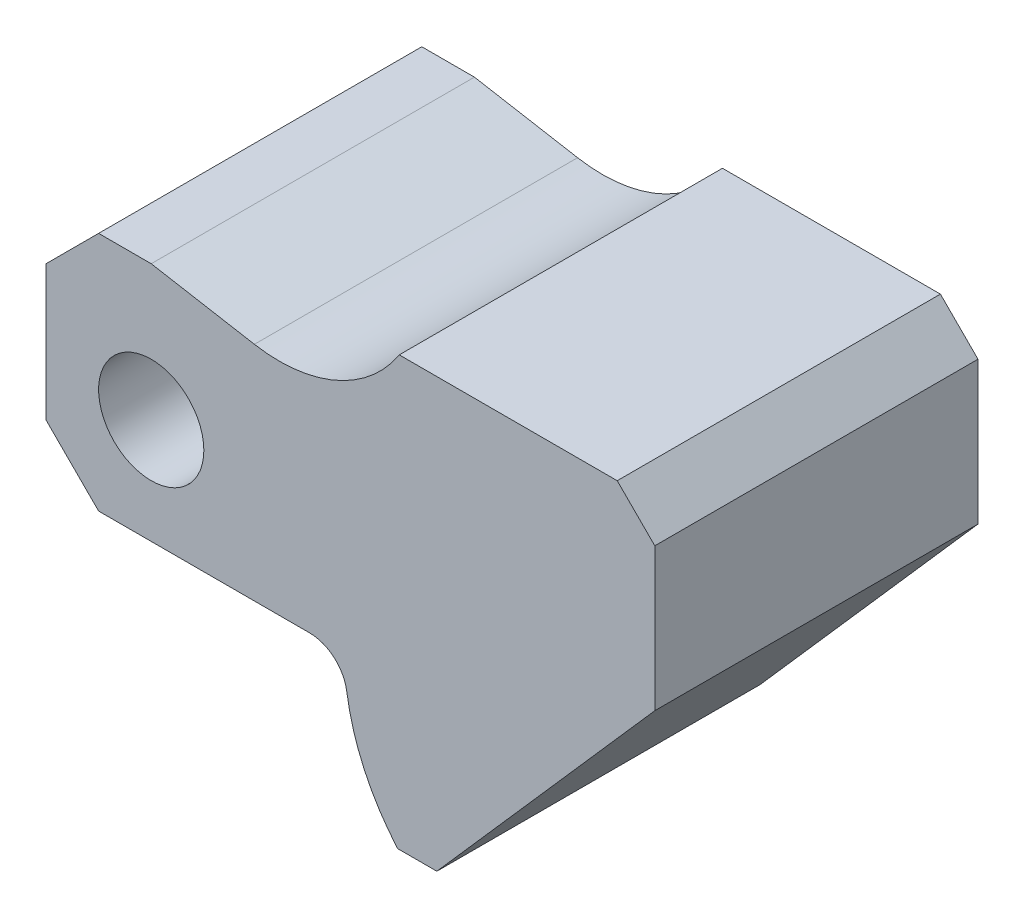
ISO-10303-21;
HEADER;
FILE_DESCRIPTION(('STEP AP214'),'2;1');
FILE_NAME('part.step','',(''),(''),'','','');
FILE_SCHEMA(('AUTOMOTIVE_DESIGN { 1 0 10303 214 1 1 1 1 }'));
ENDSEC;
DATA;
#1=APPLICATION_CONTEXT('core data for automotive mechanical design processes');
#2=APPLICATION_PROTOCOL_DEFINITION('international standard','automotive_design',2000,#1);
#3=PRODUCT_CONTEXT('',#1,'mechanical');
#4=PRODUCT('Part','Part','',(#3));
#5=PRODUCT_RELATED_PRODUCT_CATEGORY('part','',(#4));
#6=PRODUCT_DEFINITION_FORMATION('','',#4);
#7=PRODUCT_DEFINITION_CONTEXT('part definition',#1,'design');
#8=PRODUCT_DEFINITION('design','',#6,#7);
#9=PRODUCT_DEFINITION_SHAPE('','',#8);
#10=(LENGTH_UNIT() NAMED_UNIT(*) SI_UNIT(.MILLI.,.METRE.));
#11=(NAMED_UNIT(*) PLANE_ANGLE_UNIT() SI_UNIT($,.RADIAN.));
#12=(NAMED_UNIT(*) SI_UNIT($,.STERADIAN.) SOLID_ANGLE_UNIT());
#13=UNCERTAINTY_MEASURE_WITH_UNIT(LENGTH_MEASURE(1.E-05),#10,'distance_accuracy_value','');
#14=(GEOMETRIC_REPRESENTATION_CONTEXT(3) GLOBAL_UNCERTAINTY_ASSIGNED_CONTEXT((#13)) GLOBAL_UNIT_ASSIGNED_CONTEXT((#10,
#11,#12)) REPRESENTATION_CONTEXT('',''));
#15=CARTESIAN_POINT('',(0.,0.,0.));
#16=DIRECTION('',(0.,0.,1.));
#17=DIRECTION('',(1.,0.,0.));
#18=AXIS2_PLACEMENT_3D('',#15,#16,#17);
#19=CARTESIAN_POINT('',(432.512223927165,870.981308331483,1092.2));
#20=DIRECTION('',(0.,0.,1.));
#21=DIRECTION('',(1.,0.,0.));
#22=AXIS2_PLACEMENT_3D('',#19,#20,#21);
#23=PLANE('',#22);
#24=DIRECTION('',(-0.707106781186547,-0.707106781186548,0.));
#25=VECTOR('',#24,1.);
#26=CARTESIAN_POINT('',(-355.6,279.4,1092.2));
#27=LINE('',#26,#25);
#28=CARTESIAN_POINT('',(-177.8,457.2,1092.2));
#29=VERTEX_POINT('',#28);
#30=CARTESIAN_POINT('',(-355.6,279.4,1092.2));
#31=VERTEX_POINT('',#30);
#32=EDGE_CURVE('E199',#29,#31,#27,.T.);
#33=ORIENTED_EDGE('',*,*,#32,.T.);
#34=DIRECTION('',(0.,-1.,0.));
#35=VECTOR('',#34,1.);
#36=CARTESIAN_POINT('',(-355.6,279.4,1092.2));
#37=LINE('',#36,#35);
#38=CARTESIAN_POINT('',(-355.6,-177.8,1092.2));
#39=VERTEX_POINT('',#38);
#40=EDGE_CURVE('E116',#31,#39,#37,.T.);
#41=ORIENTED_EDGE('',*,*,#40,.T.);
#42=DIRECTION('',(0.707106781186548,-0.707106781186547,0.));
#43=VECTOR('',#42,1.);
#44=CARTESIAN_POINT('',(-355.6,-177.8,1092.2));
#45=LINE('',#44,#43);
#46=CARTESIAN_POINT('',(-177.8,-355.6,1092.2));
#47=VERTEX_POINT('',#46);
#48=EDGE_CURVE('E232',#39,#47,#45,.T.);
#49=ORIENTED_EDGE('',*,*,#48,.T.);
#50=DIRECTION('',(1.,0.,0.));
#51=VECTOR('',#50,1.);
#52=CARTESIAN_POINT('',(0.,-355.6,1092.2));
#53=LINE('',#52,#51);
#54=CARTESIAN_POINT('',(535.092306886378,-355.6,1092.2));
#55=VERTEX_POINT('',#54);
#56=EDGE_CURVE('E250',#47,#55,#53,.T.);
#57=ORIENTED_EDGE('',*,*,#56,.T.);
#58=CARTESIAN_POINT('',(535.092306886378,-482.6,1092.2));
#59=DIRECTION('',(0.,0.,-1.));
#60=DIRECTION('',(1.,0.,0.));
#61=AXIS2_PLACEMENT_3D('',#58,#59,#60);
#62=CIRCLE('',#61,127.);
#63=CARTESIAN_POINT('',(660.711530918239,-463.923529411765,1092.2));
#64=VERTEX_POINT('',#63);
#65=EDGE_CURVE('E247',#55,#64,#62,.T.);
#66=ORIENTED_EDGE('',*,*,#65,.T.);
#67=CARTESIAN_POINT('',(1389.30303030303,-355.6,1092.2));
#68=DIRECTION('',(0.,0.,1.));
#69=DIRECTION('',(-1.,0.,0.));
#70=AXIS2_PLACEMENT_3D('',#67,#68,#69);
#71=CIRCLE('',#70,736.6);
#72=CARTESIAN_POINT('',(832.816911877782,-838.2,1092.2));
#73=VERTEX_POINT('',#72);
#74=EDGE_CURVE('E249',#64,#73,#71,.T.);
#75=ORIENTED_EDGE('',*,*,#74,.T.);
#76=DIRECTION('',(1.,0.,0.));
#77=VECTOR('',#76,1.);
#78=CARTESIAN_POINT('',(832.816911877781,-838.2,1092.2));
#79=LINE('',#78,#77);
#80=CARTESIAN_POINT('',(965.2,-838.2,1092.2));
#81=VERTEX_POINT('',#80);
#82=EDGE_CURVE('E252',#73,#81,#79,.T.);
#83=ORIENTED_EDGE('',*,*,#82,.T.);
#84=DIRECTION('',(0.660114607728679,0.751164898449876,0.));
#85=VECTOR('',#84,1.);
#86=CARTESIAN_POINT('',(965.2,-838.2,1092.2));
#87=LINE('',#86,#85);
#88=CARTESIAN_POINT('',(1701.8,2.4980018054066E-13,1092.2));
#89=VERTEX_POINT('',#88);
#90=EDGE_CURVE('E258',#81,#89,#87,.T.);
#91=ORIENTED_EDGE('',*,*,#90,.T.);
#92=DIRECTION('',(0.,1.,0.));
#93=VECTOR('',#92,1.);
#94=CARTESIAN_POINT('',(1701.8,2.4980018054066E-13,1092.2));
#95=LINE('',#94,#93);
#96=CARTESIAN_POINT('',(1701.8,482.6,1092.2));
#97=VERTEX_POINT('',#96);
#98=EDGE_CURVE('E260',#89,#97,#95,.T.);
#99=ORIENTED_EDGE('',*,*,#98,.T.);
#100=DIRECTION('',(-0.707106781186549,0.707106781186546,0.));
#101=VECTOR('',#100,1.);
#102=CARTESIAN_POINT('',(1701.8,482.6,1092.2));
#103=LINE('',#102,#101);
#104=CARTESIAN_POINT('',(1574.8,609.6,1092.2));
#105=VERTEX_POINT('',#104);
#106=EDGE_CURVE('E262',#97,#105,#103,.T.);
#107=ORIENTED_EDGE('',*,*,#106,.T.);
#108=DIRECTION('',(-1.,0.,0.));
#109=VECTOR('',#108,1.);
#110=CARTESIAN_POINT('',(1574.8,609.6,1092.2));
#111=LINE('',#110,#109);
#112=CARTESIAN_POINT('',(838.199999999999,609.6,1092.2));
#113=VERTEX_POINT('',#112);
#114=EDGE_CURVE('E153',#105,#113,#111,.T.);
#115=ORIENTED_EDGE('',*,*,#114,.T.);
#116=CARTESIAN_POINT('',(432.512223927165,870.981308331483,1092.2));
#117=DIRECTION('',(0.,0.,-1.));
#118=DIRECTION('',(1.,0.,0.));
#119=AXIS2_PLACEMENT_3D('',#116,#117,#118);
#120=CIRCLE('',#119,482.6);
#121=CARTESIAN_POINT('',(348.709613385108,395.71308672779,1092.2));
#122=VERTEX_POINT('',#121);
#123=EDGE_CURVE('E147',#113,#122,#120,.T.);
#124=ORIENTED_EDGE('',*,*,#123,.T.);
#125=DIRECTION('',(-0.984807753012209,0.173648177666924,0.));
#126=VECTOR('',#125,1.);
#127=CARTESIAN_POINT('',(0.,457.2,1092.2));
#128=LINE('',#127,#126);
#129=CARTESIAN_POINT('',(0.,457.2,1092.2));
#130=VERTEX_POINT('',#129);
#131=EDGE_CURVE('E151',#122,#130,#128,.T.);
#132=ORIENTED_EDGE('',*,*,#131,.T.);
#133=DIRECTION('',(-1.,0.,0.));
#134=VECTOR('',#133,1.);
#135=CARTESIAN_POINT('',(0.,457.2,1092.2));
#136=LINE('',#135,#134);
#137=EDGE_CURVE('E55',#130,#29,#136,.T.);
#138=ORIENTED_EDGE('',*,*,#137,.T.);
#139=EDGE_LOOP('',(#33,#41,#49,#57,#66,#75,#83,#91,#99,#107,#115,#124,#132,#138));
#140=FACE_BOUND('',#139,.T.);
#141=CARTESIAN_POINT('',(0.,0.,1092.2));
#142=DIRECTION('',(0.,0.,1.));
#143=DIRECTION('',(1.,0.,0.));
#144=AXIS2_PLACEMENT_3D('',#141,#142,#143);
#145=CIRCLE('',#144,177.8);
#146=CARTESIAN_POINT('',(177.8,0.,1092.2));
#147=VERTEX_POINT('',#146);
#148=EDGE_CURVE('E175',#147,#147,#145,.T.);
#149=ORIENTED_EDGE('',*,*,#148,.F.);
#150=EDGE_LOOP('',(#149));
#151=FACE_BOUND('',#150,.T.);
#152=ADVANCED_FACE('F38',(#140,#151),#23,.T.);
#153=CARTESIAN_POINT('',(432.512223927165,870.981308331483,0.));
#154=DIRECTION('',(0.,0.,1.));
#155=DIRECTION('',(1.,0.,0.));
#156=AXIS2_PLACEMENT_3D('',#153,#154,#155);
#157=PLANE('',#156);
#158=DIRECTION('',(-0.707106781186547,-0.707106781186548,0.));
#159=VECTOR('',#158,1.);
#160=CARTESIAN_POINT('',(-355.6,279.4,0.));
#161=LINE('',#160,#159);
#162=CARTESIAN_POINT('',(-177.8,457.2,0.));
#163=VERTEX_POINT('',#162);
#164=CARTESIAN_POINT('',(-355.6,279.4,0.));
#165=VERTEX_POINT('',#164);
#166=EDGE_CURVE('E171',#163,#165,#161,.T.);
#167=ORIENTED_EDGE('',*,*,#166,.F.);
#168=DIRECTION('',(-1.,0.,0.));
#169=VECTOR('',#168,1.);
#170=CARTESIAN_POINT('',(0.,457.2,0.));
#171=LINE('',#170,#169);
#172=CARTESIAN_POINT('',(0.,457.2,0.));
#173=VERTEX_POINT('',#172);
#174=EDGE_CURVE('E108',#173,#163,#171,.T.);
#175=ORIENTED_EDGE('',*,*,#174,.F.);
#176=DIRECTION('',(-0.984807753012209,0.173648177666924,0.));
#177=VECTOR('',#176,1.);
#178=CARTESIAN_POINT('',(0.,457.2,0.));
#179=LINE('',#178,#177);
#180=CARTESIAN_POINT('',(348.709613385108,395.71308672779,0.));
#181=VERTEX_POINT('',#180);
#182=EDGE_CURVE('E102',#181,#173,#179,.T.);
#183=ORIENTED_EDGE('',*,*,#182,.F.);
#184=CARTESIAN_POINT('',(432.512223927165,870.981308331483,0.));
#185=DIRECTION('',(0.,0.,-1.));
#186=DIRECTION('',(1.,0.,0.));
#187=AXIS2_PLACEMENT_3D('',#184,#185,#186);
#188=CIRCLE('',#187,482.6);
#189=CARTESIAN_POINT('',(838.199999999999,609.6,0.));
#190=VERTEX_POINT('',#189);
#191=EDGE_CURVE('E161',#190,#181,#188,.T.);
#192=ORIENTED_EDGE('',*,*,#191,.F.);
#193=DIRECTION('',(-1.,0.,0.));
#194=VECTOR('',#193,1.);
#195=CARTESIAN_POINT('',(1574.8,609.6,0.));
#196=LINE('',#195,#194);
#197=CARTESIAN_POINT('',(1574.8,609.6,0.));
#198=VERTEX_POINT('',#197);
#199=EDGE_CURVE('E194',#198,#190,#196,.T.);
#200=ORIENTED_EDGE('',*,*,#199,.F.);
#201=DIRECTION('',(-0.707106781186549,0.707106781186546,0.));
#202=VECTOR('',#201,1.);
#203=CARTESIAN_POINT('',(1701.8,482.6,0.));
#204=LINE('',#203,#202);
#205=CARTESIAN_POINT('',(1701.8,482.6,0.));
#206=VERTEX_POINT('',#205);
#207=EDGE_CURVE('E192',#206,#198,#204,.T.);
#208=ORIENTED_EDGE('',*,*,#207,.F.);
#209=DIRECTION('',(0.,1.,0.));
#210=VECTOR('',#209,1.);
#211=CARTESIAN_POINT('',(1701.8,2.4980018054066E-13,0.));
#212=LINE('',#211,#210);
#213=CARTESIAN_POINT('',(1701.8,2.4980018054066E-13,0.));
#214=VERTEX_POINT('',#213);
#215=EDGE_CURVE('E190',#214,#206,#212,.T.);
#216=ORIENTED_EDGE('',*,*,#215,.F.);
#217=DIRECTION('',(0.660114607728679,0.751164898449876,0.));
#218=VECTOR('',#217,1.);
#219=CARTESIAN_POINT('',(965.2,-838.2,0.));
#220=LINE('',#219,#218);
#221=CARTESIAN_POINT('',(965.2,-838.2,0.));
#222=VERTEX_POINT('',#221);
#223=EDGE_CURVE('E188',#222,#214,#220,.T.);
#224=ORIENTED_EDGE('',*,*,#223,.F.);
#225=DIRECTION('',(1.,0.,0.));
#226=VECTOR('',#225,1.);
#227=CARTESIAN_POINT('',(832.816911877781,-838.2,0.));
#228=LINE('',#227,#226);
#229=CARTESIAN_POINT('',(832.816911877782,-838.2,0.));
#230=VERTEX_POINT('',#229);
#231=EDGE_CURVE('E186',#230,#222,#228,.T.);
#232=ORIENTED_EDGE('',*,*,#231,.F.);
#233=CARTESIAN_POINT('',(1389.30303030303,-355.6,0.));
#234=DIRECTION('',(0.,0.,1.));
#235=DIRECTION('',(-1.,0.,0.));
#236=AXIS2_PLACEMENT_3D('',#233,#234,#235);
#237=CIRCLE('',#236,736.6);
#238=CARTESIAN_POINT('',(660.711530918239,-463.923529411765,0.));
#239=VERTEX_POINT('',#238);
#240=EDGE_CURVE('E184',#239,#230,#237,.T.);
#241=ORIENTED_EDGE('',*,*,#240,.F.);
#242=CARTESIAN_POINT('',(535.092306886378,-482.6,0.));
#243=DIRECTION('',(0.,0.,-1.));
#244=DIRECTION('',(1.,0.,0.));
#245=AXIS2_PLACEMENT_3D('',#242,#243,#244);
#246=CIRCLE('',#245,127.);
#247=CARTESIAN_POINT('',(535.092306886378,-355.6,0.));
#248=VERTEX_POINT('',#247);
#249=EDGE_CURVE('E182',#248,#239,#246,.T.);
#250=ORIENTED_EDGE('',*,*,#249,.F.);
#251=DIRECTION('',(1.,0.,0.));
#252=VECTOR('',#251,1.);
#253=CARTESIAN_POINT('',(0.,-355.6,0.));
#254=LINE('',#253,#252);
#255=CARTESIAN_POINT('',(-177.8,-355.6,0.));
#256=VERTEX_POINT('',#255);
#257=EDGE_CURVE('E180',#256,#248,#254,.T.);
#258=ORIENTED_EDGE('',*,*,#257,.F.);
#259=DIRECTION('',(0.707106781186548,-0.707106781186547,0.));
#260=VECTOR('',#259,1.);
#261=CARTESIAN_POINT('',(-355.6,-177.8,0.));
#262=LINE('',#261,#260);
#263=CARTESIAN_POINT('',(-355.6,-177.8,0.));
#264=VERTEX_POINT('',#263);
#265=EDGE_CURVE('E177',#264,#256,#262,.T.);
#266=ORIENTED_EDGE('',*,*,#265,.F.);
#267=DIRECTION('',(0.,-1.,0.));
#268=VECTOR('',#267,1.);
#269=CARTESIAN_POINT('',(-355.6,279.4,0.));
#270=LINE('',#269,#268);
#271=EDGE_CURVE('E174',#165,#264,#270,.T.);
#272=ORIENTED_EDGE('',*,*,#271,.F.);
#273=EDGE_LOOP('',(#167,#175,#183,#192,#200,#208,#216,#224,#232,#241,#250,#258,#266,#272));
#274=FACE_BOUND('',#273,.T.);
#275=CARTESIAN_POINT('',(0.,0.,0.));
#276=DIRECTION('',(0.,0.,1.));
#277=DIRECTION('',(1.,0.,0.));
#278=AXIS2_PLACEMENT_3D('',#275,#276,#277);
#279=CIRCLE('',#278,177.8);
#280=CARTESIAN_POINT('',(177.8,0.,0.));
#281=VERTEX_POINT('',#280);
#282=EDGE_CURVE('E506',#281,#281,#279,.T.);
#283=ORIENTED_EDGE('',*,*,#282,.T.);
#284=EDGE_LOOP('',(#283));
#285=FACE_BOUND('',#284,.T.);
#286=ADVANCED_FACE('F235',(#274,#285),#157,.F.);
#287=CARTESIAN_POINT('',(-355.6,279.4,1092.2));
#288=DIRECTION('',(0.707106781186548,-0.707106781186547,0.));
#289=DIRECTION('',(0.707106781186547,0.707106781186548,0.));
#290=AXIS2_PLACEMENT_3D('',#287,#288,#289);
#291=PLANE('',#290);
#292=ORIENTED_EDGE('',*,*,#166,.T.);
#293=DIRECTION('',(0.,0.,-1.));
#294=VECTOR('',#293,1.);
#295=CARTESIAN_POINT('',(-355.6,279.4,1092.2));
#296=LINE('',#295,#294);
#297=EDGE_CURVE('E11',#31,#165,#296,.T.);
#298=ORIENTED_EDGE('',*,*,#297,.F.);
#299=ORIENTED_EDGE('',*,*,#32,.F.);
#300=DIRECTION('',(0.,0.,-1.));
#301=VECTOR('',#300,1.);
#302=CARTESIAN_POINT('',(-177.8,457.2,1092.2));
#303=LINE('',#302,#301);
#304=EDGE_CURVE('E167',#29,#163,#303,.T.);
#305=ORIENTED_EDGE('',*,*,#304,.T.);
#306=EDGE_LOOP('',(#292,#298,#299,#305));
#307=FACE_BOUND('',#306,.T.);
#308=ADVANCED_FACE('F40',(#307),#291,.F.);
#309=CARTESIAN_POINT('',(-355.6,279.4,1092.2));
#310=DIRECTION('',(1.,0.,0.));
#311=DIRECTION('',(0.,1.,0.));
#312=AXIS2_PLACEMENT_3D('',#309,#310,#311);
#313=PLANE('',#312);
#314=ORIENTED_EDGE('',*,*,#271,.T.);
#315=DIRECTION('',(0.,0.,-1.));
#316=VECTOR('',#315,1.);
#317=CARTESIAN_POINT('',(-355.6,-177.8,1092.2));
#318=LINE('',#317,#316);
#319=EDGE_CURVE('E47',#39,#264,#318,.T.);
#320=ORIENTED_EDGE('',*,*,#319,.F.);
#321=ORIENTED_EDGE('',*,*,#40,.F.);
#322=ORIENTED_EDGE('',*,*,#297,.T.);
#323=EDGE_LOOP('',(#314,#320,#321,#322));
#324=FACE_BOUND('',#323,.T.);
#325=ADVANCED_FACE('F296',(#324),#313,.F.);
#326=CARTESIAN_POINT('',(-355.6,-177.8,1092.2));
#327=DIRECTION('',(0.707106781186547,0.707106781186548,0.));
#328=DIRECTION('',(-0.707106781186548,0.707106781186547,0.));
#329=AXIS2_PLACEMENT_3D('',#326,#327,#328);
#330=PLANE('',#329);
#331=ORIENTED_EDGE('',*,*,#265,.T.);
#332=DIRECTION('',(0.,0.,-1.));
#333=VECTOR('',#332,1.);
#334=CARTESIAN_POINT('',(-177.8,-355.6,1092.2));
#335=LINE('',#334,#333);
#336=EDGE_CURVE('E224',#47,#256,#335,.T.);
#337=ORIENTED_EDGE('',*,*,#336,.F.);
#338=ORIENTED_EDGE('',*,*,#48,.F.);
#339=ORIENTED_EDGE('',*,*,#319,.T.);
#340=EDGE_LOOP('',(#331,#337,#338,#339));
#341=FACE_BOUND('',#340,.T.);
#342=ADVANCED_FACE('F230',(#341),#330,.F.);
#343=CARTESIAN_POINT('',(0.,-355.6,1092.2));
#344=DIRECTION('',(0.,1.,0.));
#345=DIRECTION('',(-1.,0.,0.));
#346=AXIS2_PLACEMENT_3D('',#343,#344,#345);
#347=PLANE('',#346);
#348=ORIENTED_EDGE('',*,*,#257,.T.);
#349=DIRECTION('',(0.,0.,-1.));
#350=VECTOR('',#349,1.);
#351=CARTESIAN_POINT('',(535.092306886378,-355.6,1092.2));
#352=LINE('',#351,#350);
#353=EDGE_CURVE('E221',#55,#248,#352,.T.);
#354=ORIENTED_EDGE('',*,*,#353,.F.);
#355=ORIENTED_EDGE('',*,*,#56,.F.);
#356=ORIENTED_EDGE('',*,*,#336,.T.);
#357=EDGE_LOOP('',(#348,#354,#355,#356));
#358=FACE_BOUND('',#357,.T.);
#359=ADVANCED_FACE('F241',(#358),#347,.F.);
#360=CARTESIAN_POINT('',(535.092306886378,-482.6,1092.2));
#361=DIRECTION('',(0.,0.,-1.));
#362=DIRECTION('',(-1.,0.,0.));
#363=AXIS2_PLACEMENT_3D('',#360,#361,#362);
#364=CYLINDRICAL_SURFACE('',#363,127.);
#365=ORIENTED_EDGE('',*,*,#249,.T.);
#366=DIRECTION('',(0.,0.,-1.));
#367=VECTOR('',#366,1.);
#368=CARTESIAN_POINT('',(660.711530918239,-463.923529411765,1092.2));
#369=LINE('',#368,#367);
#370=EDGE_CURVE('E218',#64,#239,#369,.T.);
#371=ORIENTED_EDGE('',*,*,#370,.F.);
#372=ORIENTED_EDGE('',*,*,#65,.F.);
#373=ORIENTED_EDGE('',*,*,#353,.T.);
#374=EDGE_LOOP('',(#365,#371,#372,#373));
#375=FACE_BOUND('',#374,.T.);
#376=ADVANCED_FACE('F245',(#375),#364,.F.);
#377=CARTESIAN_POINT('',(1389.30303030303,-355.6,1092.2));
#378=DIRECTION('',(0.,0.,-1.));
#379=DIRECTION('',(-1.,0.,0.));
#380=AXIS2_PLACEMENT_3D('',#377,#378,#379);
#381=CYLINDRICAL_SURFACE('',#380,736.6);
#382=ORIENTED_EDGE('',*,*,#240,.T.);
#383=DIRECTION('',(0.,0.,-1.));
#384=VECTOR('',#383,1.);
#385=CARTESIAN_POINT('',(832.816911877782,-838.2,1092.2));
#386=LINE('',#385,#384);
#387=EDGE_CURVE('E215',#73,#230,#386,.T.);
#388=ORIENTED_EDGE('',*,*,#387,.F.);
#389=ORIENTED_EDGE('',*,*,#74,.F.);
#390=ORIENTED_EDGE('',*,*,#370,.T.);
#391=EDGE_LOOP('',(#382,#388,#389,#390));
#392=FACE_BOUND('',#391,.T.);
#393=ADVANCED_FACE('F309',(#392),#381,.T.);
#394=CARTESIAN_POINT('',(832.816911877781,-838.2,1092.2));
#395=DIRECTION('',(0.,1.,0.));
#396=DIRECTION('',(-1.,0.,0.));
#397=AXIS2_PLACEMENT_3D('',#394,#395,#396);
#398=PLANE('',#397);
#399=ORIENTED_EDGE('',*,*,#231,.T.);
#400=DIRECTION('',(0.,0.,-1.));
#401=VECTOR('',#400,1.);
#402=CARTESIAN_POINT('',(965.2,-838.2,1092.2));
#403=LINE('',#402,#401);
#404=EDGE_CURVE('E212',#81,#222,#403,.T.);
#405=ORIENTED_EDGE('',*,*,#404,.F.);
#406=ORIENTED_EDGE('',*,*,#82,.F.);
#407=ORIENTED_EDGE('',*,*,#387,.T.);
#408=EDGE_LOOP('',(#399,#405,#406,#407));
#409=FACE_BOUND('',#408,.T.);
#410=ADVANCED_FACE('F312',(#409),#398,.F.);
#411=CARTESIAN_POINT('',(965.2,-838.2,1092.2));
#412=DIRECTION('',(-0.751164898449876,0.660114607728679,0.));
#413=DIRECTION('',(-0.660114607728679,-0.751164898449876,0.));
#414=AXIS2_PLACEMENT_3D('',#411,#412,#413);
#415=PLANE('',#414);
#416=ORIENTED_EDGE('',*,*,#223,.T.);
#417=DIRECTION('',(0.,0.,-1.));
#418=VECTOR('',#417,1.);
#419=CARTESIAN_POINT('',(1701.8,2.4980018054066E-13,1092.2));
#420=LINE('',#419,#418);
#421=EDGE_CURVE('E209',#89,#214,#420,.T.);
#422=ORIENTED_EDGE('',*,*,#421,.F.);
#423=ORIENTED_EDGE('',*,*,#90,.F.);
#424=ORIENTED_EDGE('',*,*,#404,.T.);
#425=EDGE_LOOP('',(#416,#422,#423,#424));
#426=FACE_BOUND('',#425,.T.);
#427=ADVANCED_FACE('F316',(#426),#415,.F.);
#428=CARTESIAN_POINT('',(1701.8,2.4980018054066E-13,1092.2));
#429=DIRECTION('',(-1.,0.,0.));
#430=DIRECTION('',(0.,0.,1.));
#431=AXIS2_PLACEMENT_3D('',#428,#429,#430);
#432=PLANE('',#431);
#433=ORIENTED_EDGE('',*,*,#215,.T.);
#434=DIRECTION('',(0.,0.,-1.));
#435=VECTOR('',#434,1.);
#436=CARTESIAN_POINT('',(1701.8,482.6,1092.2));
#437=LINE('',#436,#435);
#438=EDGE_CURVE('E206',#97,#206,#437,.T.);
#439=ORIENTED_EDGE('',*,*,#438,.F.);
#440=ORIENTED_EDGE('',*,*,#98,.F.);
#441=ORIENTED_EDGE('',*,*,#421,.T.);
#442=EDGE_LOOP('',(#433,#439,#440,#441));
#443=FACE_BOUND('',#442,.T.);
#444=ADVANCED_FACE('F320',(#443),#432,.F.);
#445=CARTESIAN_POINT('',(1701.8,482.6,1092.2));
#446=DIRECTION('',(-0.707106781186546,-0.707106781186549,0.));
#447=DIRECTION('',(0.707106781186549,-0.707106781186546,0.));
#448=AXIS2_PLACEMENT_3D('',#445,#446,#447);
#449=PLANE('',#448);
#450=ORIENTED_EDGE('',*,*,#207,.T.);
#451=DIRECTION('',(0.,0.,-1.));
#452=VECTOR('',#451,1.);
#453=CARTESIAN_POINT('',(1574.8,609.6,1092.2));
#454=LINE('',#453,#452);
#455=EDGE_CURVE('E203',#105,#198,#454,.T.);
#456=ORIENTED_EDGE('',*,*,#455,.F.);
#457=ORIENTED_EDGE('',*,*,#106,.F.);
#458=ORIENTED_EDGE('',*,*,#438,.T.);
#459=EDGE_LOOP('',(#450,#456,#457,#458));
#460=FACE_BOUND('',#459,.T.);
#461=ADVANCED_FACE('F268',(#460),#449,.F.);
#462=CARTESIAN_POINT('',(1574.8,609.6,1092.2));
#463=DIRECTION('',(0.,-1.,0.));
#464=DIRECTION('',(0.,0.,-1.));
#465=AXIS2_PLACEMENT_3D('',#462,#463,#464);
#466=PLANE('',#465);
#467=ORIENTED_EDGE('',*,*,#199,.T.);
#468=DIRECTION('',(0.,0.,-1.));
#469=VECTOR('',#468,1.);
#470=CARTESIAN_POINT('',(838.199999999999,609.6,1092.2));
#471=LINE('',#470,#469);
#472=EDGE_CURVE('E162',#113,#190,#471,.T.);
#473=ORIENTED_EDGE('',*,*,#472,.F.);
#474=ORIENTED_EDGE('',*,*,#114,.F.);
#475=ORIENTED_EDGE('',*,*,#455,.T.);
#476=EDGE_LOOP('',(#467,#473,#474,#475));
#477=FACE_BOUND('',#476,.T.);
#478=ADVANCED_FACE('F272',(#477),#466,.F.);
#479=CARTESIAN_POINT('',(432.512223927165,870.981308331483,1092.2));
#480=DIRECTION('',(0.,0.,-1.));
#481=DIRECTION('',(-1.,0.,0.));
#482=AXIS2_PLACEMENT_3D('',#479,#480,#481);
#483=CYLINDRICAL_SURFACE('',#482,482.6);
#484=ORIENTED_EDGE('',*,*,#191,.T.);
#485=DIRECTION('',(0.,0.,-1.));
#486=VECTOR('',#485,1.);
#487=CARTESIAN_POINT('',(348.709613385108,395.71308672779,1092.2));
#488=LINE('',#487,#486);
#489=EDGE_CURVE('E158',#122,#181,#488,.T.);
#490=ORIENTED_EDGE('',*,*,#489,.F.);
#491=ORIENTED_EDGE('',*,*,#123,.F.);
#492=ORIENTED_EDGE('',*,*,#472,.T.);
#493=EDGE_LOOP('',(#484,#490,#491,#492));
#494=FACE_BOUND('',#493,.T.);
#495=ADVANCED_FACE('F159',(#494),#483,.F.);
#496=CARTESIAN_POINT('',(0.,457.2,1092.2));
#497=DIRECTION('',(-0.173648177666924,-0.984807753012209,0.));
#498=DIRECTION('',(0.984807753012209,-0.173648177666924,0.));
#499=AXIS2_PLACEMENT_3D('',#496,#497,#498);
#500=PLANE('',#499);
#501=ORIENTED_EDGE('',*,*,#182,.T.);
#502=DIRECTION('',(0.,0.,-1.));
#503=VECTOR('',#502,1.);
#504=CARTESIAN_POINT('',(0.,457.2,1092.2));
#505=LINE('',#504,#503);
#506=EDGE_CURVE('E163',#130,#173,#505,.T.);
#507=ORIENTED_EDGE('',*,*,#506,.F.);
#508=ORIENTED_EDGE('',*,*,#131,.F.);
#509=ORIENTED_EDGE('',*,*,#489,.T.);
#510=EDGE_LOOP('',(#501,#507,#508,#509));
#511=FACE_BOUND('',#510,.T.);
#512=ADVANCED_FACE('F165',(#511),#500,.F.);
#513=CARTESIAN_POINT('',(0.,457.2,1092.2));
#514=DIRECTION('',(0.,-1.,0.));
#515=DIRECTION('',(0.,0.,-1.));
#516=AXIS2_PLACEMENT_3D('',#513,#514,#515);
#517=PLANE('',#516);
#518=ORIENTED_EDGE('',*,*,#174,.T.);
#519=ORIENTED_EDGE('',*,*,#304,.F.);
#520=ORIENTED_EDGE('',*,*,#137,.F.);
#521=ORIENTED_EDGE('',*,*,#506,.T.);
#522=EDGE_LOOP('',(#518,#519,#520,#521));
#523=FACE_BOUND('',#522,.T.);
#524=ADVANCED_FACE('F276',(#523),#517,.F.);
#525=CARTESIAN_POINT('',(0.,0.,1092.2));
#526=DIRECTION('',(0.,0.,-1.));
#527=DIRECTION('',(-1.,0.,0.));
#528=AXIS2_PLACEMENT_3D('',#525,#526,#527);
#529=CYLINDRICAL_SURFACE('',#528,177.8);
#530=ORIENTED_EDGE('',*,*,#148,.T.);
#531=EDGE_LOOP('',(#530));
#532=FACE_BOUND('',#531,.T.);
#533=ORIENTED_EDGE('',*,*,#282,.F.);
#534=EDGE_LOOP('',(#533));
#535=FACE_BOUND('',#534,.T.);
#536=ADVANCED_FACE('F278',(#532,#535),#529,.F.);
#537=CLOSED_SHELL('',(#152,#286,#308,#325,#342,#359,#376,#393,#410,#427,#444,#461,#478,#495,
#512,#524,#536));
#538=MANIFOLD_SOLID_BREP('B2',#537);
#539=ADVANCED_BREP_SHAPE_REPRESENTATION('',(#18,#538),#14);
#540=SHAPE_DEFINITION_REPRESENTATION(#9,#539);
ENDSEC;
END-ISO-10303-21;
